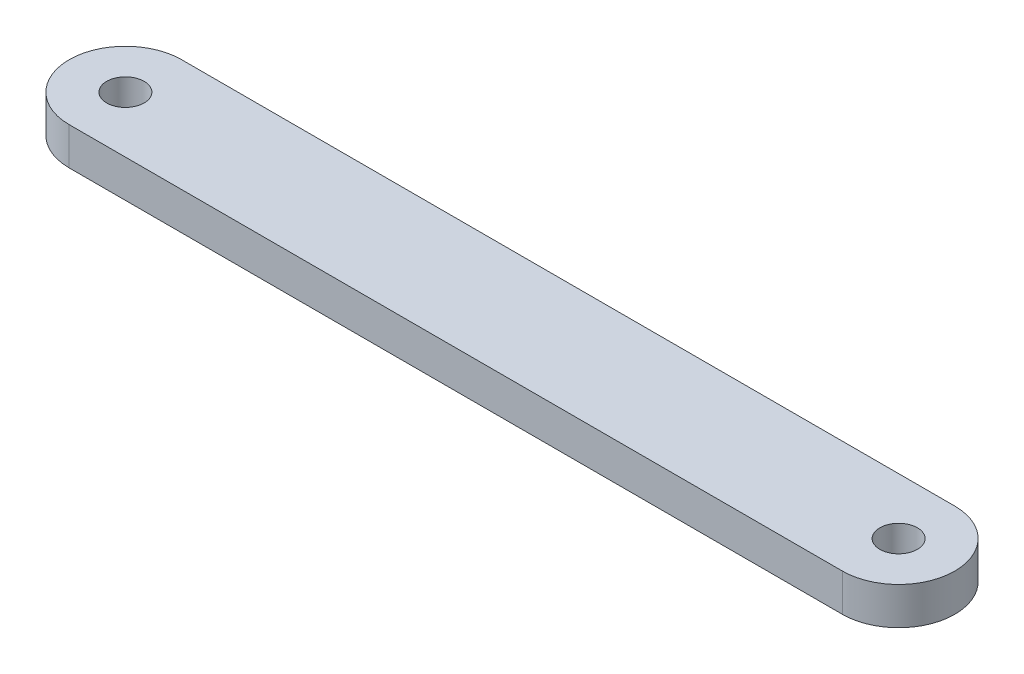
ISO-10303-21;
HEADER;
FILE_DESCRIPTION(('STEP AP214'),'2;1');
FILE_NAME('part.step','',(''),(''),'','','');
FILE_SCHEMA(('AUTOMOTIVE_DESIGN { 1 0 10303 214 1 1 1 1 }'));
ENDSEC;
DATA;
#1=APPLICATION_CONTEXT('core data for automotive mechanical design processes');
#2=APPLICATION_PROTOCOL_DEFINITION('international standard','automotive_design',2000,#1);
#3=PRODUCT_CONTEXT('',#1,'mechanical');
#4=PRODUCT('Part','Part','',(#3));
#5=PRODUCT_RELATED_PRODUCT_CATEGORY('part','',(#4));
#6=PRODUCT_DEFINITION_FORMATION('','',#4);
#7=PRODUCT_DEFINITION_CONTEXT('part definition',#1,'design');
#8=PRODUCT_DEFINITION('design','',#6,#7);
#9=PRODUCT_DEFINITION_SHAPE('','',#8);
#10=(LENGTH_UNIT() NAMED_UNIT(*) SI_UNIT(.MILLI.,.METRE.));
#11=(NAMED_UNIT(*) PLANE_ANGLE_UNIT() SI_UNIT($,.RADIAN.));
#12=(NAMED_UNIT(*) SI_UNIT($,.STERADIAN.) SOLID_ANGLE_UNIT());
#13=UNCERTAINTY_MEASURE_WITH_UNIT(LENGTH_MEASURE(1.E-05),#10,'distance_accuracy_value','');
#14=(GEOMETRIC_REPRESENTATION_CONTEXT(3) GLOBAL_UNCERTAINTY_ASSIGNED_CONTEXT((#13)) GLOBAL_UNIT_ASSIGNED_CONTEXT((#10,
#11,#12)) REPRESENTATION_CONTEXT('',''));
#15=CARTESIAN_POINT('',(0.,0.,0.));
#16=DIRECTION('',(0.,0.,1.));
#17=DIRECTION('',(1.,0.,0.));
#18=AXIS2_PLACEMENT_3D('',#15,#16,#17);
#19=CARTESIAN_POINT('',(-41.24527328,4.5,0.));
#20=DIRECTION('',(0.,1.,0.));
#21=DIRECTION('',(0.,0.,1.));
#22=AXIS2_PLACEMENT_3D('',#19,#20,#21);
#23=PLANE('',#22);
#24=CARTESIAN_POINT('',(-41.24527328,4.5,0.));
#25=DIRECTION('',(0.,1.,0.));
#26=DIRECTION('',(0.,0.,1.));
#27=AXIS2_PLACEMENT_3D('',#24,#25,#26);
#28=CIRCLE('',#27,2.);
#29=CARTESIAN_POINT('',(-41.24527328,4.5,2.));
#30=VERTEX_POINT('',#29);
#31=EDGE_CURVE('E127',#30,#30,#28,.T.);
#32=ORIENTED_EDGE('',*,*,#31,.F.);
#33=EDGE_LOOP('',(#32));
#34=FACE_BOUND('',#33,.T.);
#35=CARTESIAN_POINT('',(41.24527328,4.5,0.));
#36=DIRECTION('',(0.,1.,0.));
#37=DIRECTION('',(0.,0.,1.));
#38=AXIS2_PLACEMENT_3D('',#35,#36,#37);
#39=CIRCLE('',#38,2.);
#40=CARTESIAN_POINT('',(41.24527328,4.5,1.99999999999999));
#41=VERTEX_POINT('',#40);
#42=EDGE_CURVE('E124',#41,#41,#39,.T.);
#43=ORIENTED_EDGE('',*,*,#42,.F.);
#44=EDGE_LOOP('',(#43));
#45=FACE_BOUND('',#44,.T.);
#46=CARTESIAN_POINT('',(-41.24527328,4.5,0.));
#47=DIRECTION('',(0.,1.,0.));
#48=DIRECTION('',(0.,0.,1.));
#49=AXIS2_PLACEMENT_3D('',#46,#47,#48);
#50=CIRCLE('',#49,6.);
#51=CARTESIAN_POINT('',(-41.24527328,4.5,-6.));
#52=VERTEX_POINT('',#51);
#53=CARTESIAN_POINT('',(-41.24527328,4.5,6.));
#54=VERTEX_POINT('',#53);
#55=EDGE_CURVE('E95',#52,#54,#50,.T.);
#56=ORIENTED_EDGE('',*,*,#55,.T.);
#57=DIRECTION('',(1.,0.,0.));
#58=VECTOR('',#57,1.);
#59=CARTESIAN_POINT('',(-41.24527328,4.5,6.));
#60=LINE('',#59,#58);
#61=CARTESIAN_POINT('',(41.24527328,4.5,5.99999999999998));
#62=VERTEX_POINT('',#61);
#63=EDGE_CURVE('E91',#54,#62,#60,.T.);
#64=ORIENTED_EDGE('',*,*,#63,.T.);
#65=CARTESIAN_POINT('',(41.24527328,4.5,0.));
#66=DIRECTION('',(0.,1.,0.));
#67=DIRECTION('',(0.,0.,1.));
#68=AXIS2_PLACEMENT_3D('',#65,#66,#67);
#69=CIRCLE('',#68,6.);
#70=CARTESIAN_POINT('',(41.24527328,4.5,-6.00000000000002));
#71=VERTEX_POINT('',#70);
#72=EDGE_CURVE('E93',#62,#71,#69,.T.);
#73=ORIENTED_EDGE('',*,*,#72,.T.);
#74=DIRECTION('',(-1.,0.,0.));
#75=VECTOR('',#74,1.);
#76=CARTESIAN_POINT('',(-41.24527328,4.5,-6.));
#77=LINE('',#76,#75);
#78=EDGE_CURVE('E61',#71,#52,#77,.T.);
#79=ORIENTED_EDGE('',*,*,#78,.T.);
#80=EDGE_LOOP('',(#56,#64,#73,#79));
#81=FACE_BOUND('',#80,.T.);
#82=ADVANCED_FACE('F44',(#34,#45,#81),#23,.T.);
#83=CARTESIAN_POINT('',(-41.24527328,0.5,0.));
#84=DIRECTION('',(0.,1.,0.));
#85=DIRECTION('',(0.,0.,1.));
#86=AXIS2_PLACEMENT_3D('',#83,#84,#85);
#87=PLANE('',#86);
#88=CARTESIAN_POINT('',(-41.24527328,0.5,0.));
#89=DIRECTION('',(0.,1.,0.));
#90=DIRECTION('',(0.,0.,1.));
#91=AXIS2_PLACEMENT_3D('',#88,#89,#90);
#92=CIRCLE('',#91,2.);
#93=CARTESIAN_POINT('',(-41.24527328,0.5,2.));
#94=VERTEX_POINT('',#93);
#95=EDGE_CURVE('E110',#94,#94,#92,.T.);
#96=ORIENTED_EDGE('',*,*,#95,.T.);
#97=EDGE_LOOP('',(#96));
#98=FACE_BOUND('',#97,.T.);
#99=CARTESIAN_POINT('',(41.24527328,0.5,0.));
#100=DIRECTION('',(0.,1.,0.));
#101=DIRECTION('',(0.,0.,1.));
#102=AXIS2_PLACEMENT_3D('',#99,#100,#101);
#103=CIRCLE('',#102,2.);
#104=CARTESIAN_POINT('',(41.24527328,0.5,1.99999999999999));
#105=VERTEX_POINT('',#104);
#106=EDGE_CURVE('E121',#105,#105,#103,.T.);
#107=ORIENTED_EDGE('',*,*,#106,.T.);
#108=EDGE_LOOP('',(#107));
#109=FACE_BOUND('',#108,.T.);
#110=CARTESIAN_POINT('',(-41.24527328,0.5,0.));
#111=DIRECTION('',(0.,1.,0.));
#112=DIRECTION('',(0.,0.,1.));
#113=AXIS2_PLACEMENT_3D('',#110,#111,#112);
#114=CIRCLE('',#113,6.);
#115=CARTESIAN_POINT('',(-41.24527328,0.5,-6.));
#116=VERTEX_POINT('',#115);
#117=CARTESIAN_POINT('',(-41.24527328,0.5,6.));
#118=VERTEX_POINT('',#117);
#119=EDGE_CURVE('E107',#116,#118,#114,.T.);
#120=ORIENTED_EDGE('',*,*,#119,.F.);
#121=DIRECTION('',(-1.,0.,0.));
#122=VECTOR('',#121,1.);
#123=CARTESIAN_POINT('',(-41.24527328,0.5,-6.));
#124=LINE('',#123,#122);
#125=CARTESIAN_POINT('',(41.24527328,0.5,-6.00000000000002));
#126=VERTEX_POINT('',#125);
#127=EDGE_CURVE('E84',#126,#116,#124,.T.);
#128=ORIENTED_EDGE('',*,*,#127,.F.);
#129=CARTESIAN_POINT('',(41.24527328,0.5,0.));
#130=DIRECTION('',(0.,1.,0.));
#131=DIRECTION('',(0.,0.,1.));
#132=AXIS2_PLACEMENT_3D('',#129,#130,#131);
#133=CIRCLE('',#132,6.);
#134=CARTESIAN_POINT('',(41.24527328,0.5,5.99999999999998));
#135=VERTEX_POINT('',#134);
#136=EDGE_CURVE('E78',#135,#126,#133,.T.);
#137=ORIENTED_EDGE('',*,*,#136,.F.);
#138=DIRECTION('',(1.,0.,0.));
#139=VECTOR('',#138,1.);
#140=CARTESIAN_POINT('',(-41.24527328,0.5,6.));
#141=LINE('',#140,#139);
#142=EDGE_CURVE('E99',#118,#135,#141,.T.);
#143=ORIENTED_EDGE('',*,*,#142,.F.);
#144=EDGE_LOOP('',(#120,#128,#137,#143));
#145=FACE_BOUND('',#144,.T.);
#146=ADVANCED_FACE('F118',(#98,#109,#145),#87,.F.);
#147=CARTESIAN_POINT('',(-41.24527328,4.5,0.));
#148=DIRECTION('',(0.,-1.,0.));
#149=DIRECTION('',(0.,0.,-1.));
#150=AXIS2_PLACEMENT_3D('',#147,#148,#149);
#151=CYLINDRICAL_SURFACE('',#150,6.);
#152=ORIENTED_EDGE('',*,*,#119,.T.);
#153=DIRECTION('',(0.,-1.,0.));
#154=VECTOR('',#153,1.);
#155=CARTESIAN_POINT('',(-41.24527328,4.5,6.));
#156=LINE('',#155,#154);
#157=EDGE_CURVE('E11',#54,#118,#156,.T.);
#158=ORIENTED_EDGE('',*,*,#157,.F.);
#159=ORIENTED_EDGE('',*,*,#55,.F.);
#160=DIRECTION('',(0.,-1.,0.));
#161=VECTOR('',#160,1.);
#162=CARTESIAN_POINT('',(-41.24527328,4.5,-6.));
#163=LINE('',#162,#161);
#164=EDGE_CURVE('E103',#52,#116,#163,.T.);
#165=ORIENTED_EDGE('',*,*,#164,.T.);
#166=EDGE_LOOP('',(#152,#158,#159,#165));
#167=FACE_BOUND('',#166,.T.);
#168=ADVANCED_FACE('F46',(#167),#151,.T.);
#169=CARTESIAN_POINT('',(-41.24527328,4.5,6.));
#170=DIRECTION('',(0.,0.,-1.));
#171=DIRECTION('',(-1.,0.,0.));
#172=AXIS2_PLACEMENT_3D('',#169,#170,#171);
#173=PLANE('',#172);
#174=ORIENTED_EDGE('',*,*,#142,.T.);
#175=DIRECTION('',(0.,-1.,0.));
#176=VECTOR('',#175,1.);
#177=CARTESIAN_POINT('',(41.24527328,4.5,5.99999999999998));
#178=LINE('',#177,#176);
#179=EDGE_CURVE('E53',#62,#135,#178,.T.);
#180=ORIENTED_EDGE('',*,*,#179,.F.);
#181=ORIENTED_EDGE('',*,*,#63,.F.);
#182=ORIENTED_EDGE('',*,*,#157,.T.);
#183=EDGE_LOOP('',(#174,#180,#181,#182));
#184=FACE_BOUND('',#183,.T.);
#185=ADVANCED_FACE('F98',(#184),#173,.F.);
#186=CARTESIAN_POINT('',(41.24527328,4.5,0.));
#187=DIRECTION('',(0.,-1.,0.));
#188=DIRECTION('',(0.,0.,-1.));
#189=AXIS2_PLACEMENT_3D('',#186,#187,#188);
#190=CYLINDRICAL_SURFACE('',#189,6.);
#191=ORIENTED_EDGE('',*,*,#136,.T.);
#192=DIRECTION('',(0.,-1.,0.));
#193=VECTOR('',#192,1.);
#194=CARTESIAN_POINT('',(41.24527328,4.5,-6.00000000000002));
#195=LINE('',#194,#193);
#196=EDGE_CURVE('E100',#71,#126,#195,.T.);
#197=ORIENTED_EDGE('',*,*,#196,.F.);
#198=ORIENTED_EDGE('',*,*,#72,.F.);
#199=ORIENTED_EDGE('',*,*,#179,.T.);
#200=EDGE_LOOP('',(#191,#197,#198,#199));
#201=FACE_BOUND('',#200,.T.);
#202=ADVANCED_FACE('F101',(#201),#190,.T.);
#203=CARTESIAN_POINT('',(-41.24527328,4.5,-6.));
#204=DIRECTION('',(0.,0.,1.));
#205=DIRECTION('',(1.,0.,0.));
#206=AXIS2_PLACEMENT_3D('',#203,#204,#205);
#207=PLANE('',#206);
#208=ORIENTED_EDGE('',*,*,#127,.T.);
#209=ORIENTED_EDGE('',*,*,#164,.F.);
#210=ORIENTED_EDGE('',*,*,#78,.F.);
#211=ORIENTED_EDGE('',*,*,#196,.T.);
#212=EDGE_LOOP('',(#208,#209,#210,#211));
#213=FACE_BOUND('',#212,.T.);
#214=ADVANCED_FACE('F115',(#213),#207,.F.);
#215=CARTESIAN_POINT('',(41.24527328,0.5,0.));
#216=DIRECTION('',(0.,1.,0.));
#217=DIRECTION('',(0.,0.,1.));
#218=AXIS2_PLACEMENT_3D('',#215,#216,#217);
#219=CYLINDRICAL_SURFACE('',#218,2.);
#220=ORIENTED_EDGE('',*,*,#106,.F.);
#221=EDGE_LOOP('',(#220));
#222=FACE_BOUND('',#221,.T.);
#223=ORIENTED_EDGE('',*,*,#42,.T.);
#224=EDGE_LOOP('',(#223));
#225=FACE_BOUND('',#224,.T.);
#226=ADVANCED_FACE('F138',(#222,#225),#219,.F.);
#227=CARTESIAN_POINT('',(-41.24527328,0.5,0.));
#228=DIRECTION('',(0.,1.,0.));
#229=DIRECTION('',(0.,0.,1.));
#230=AXIS2_PLACEMENT_3D('',#227,#228,#229);
#231=CYLINDRICAL_SURFACE('',#230,2.);
#232=ORIENTED_EDGE('',*,*,#95,.F.);
#233=EDGE_LOOP('',(#232));
#234=FACE_BOUND('',#233,.T.);
#235=ORIENTED_EDGE('',*,*,#31,.T.);
#236=EDGE_LOOP('',(#235));
#237=FACE_BOUND('',#236,.T.);
#238=ADVANCED_FACE('F135',(#234,#237),#231,.F.);
#239=CLOSED_SHELL('',(#82,#146,#168,#185,#202,#214,#226,#238));
#240=MANIFOLD_SOLID_BREP('B2',#239);
#241=ADVANCED_BREP_SHAPE_REPRESENTATION('',(#18,#240),#14);
#242=SHAPE_DEFINITION_REPRESENTATION(#9,#241);
ENDSEC;
END-ISO-10303-21;
